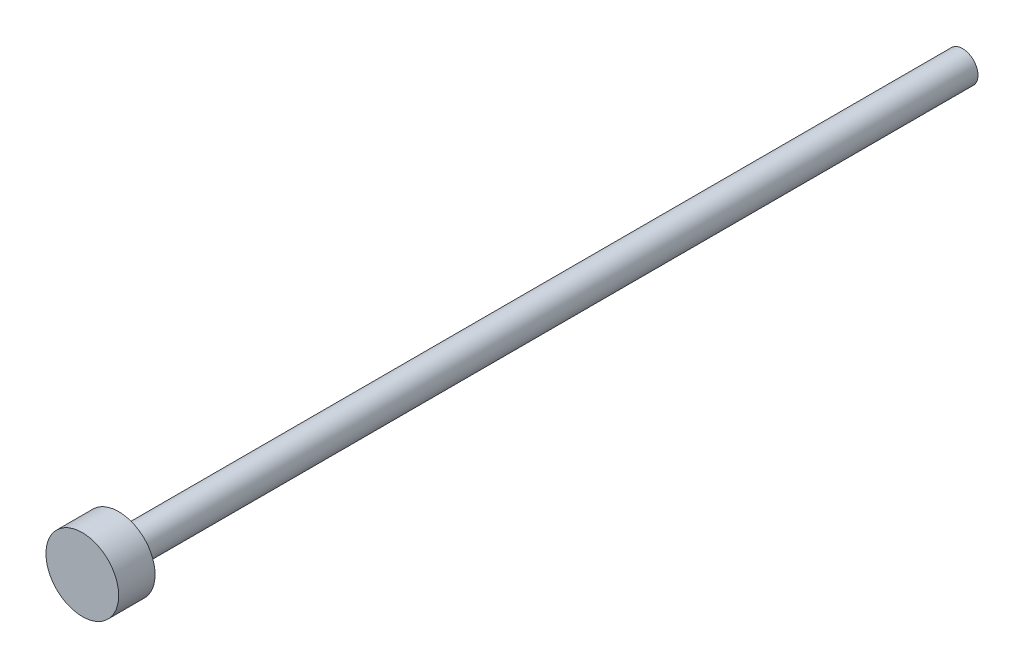
ISO-10303-21;
HEADER;
FILE_DESCRIPTION(('STEP AP214'),'2;1');
FILE_NAME('part.step','',(''),(''),'','','');
FILE_SCHEMA(('AUTOMOTIVE_DESIGN { 1 0 10303 214 1 1 1 1 }'));
ENDSEC;
DATA;
#1=APPLICATION_CONTEXT('core data for automotive mechanical design processes');
#2=APPLICATION_PROTOCOL_DEFINITION('international standard','automotive_design',2000,#1);
#3=PRODUCT_CONTEXT('',#1,'mechanical');
#4=PRODUCT('Part','Part','',(#3));
#5=PRODUCT_RELATED_PRODUCT_CATEGORY('part','',(#4));
#6=PRODUCT_DEFINITION_FORMATION('','',#4);
#7=PRODUCT_DEFINITION_CONTEXT('part definition',#1,'design');
#8=PRODUCT_DEFINITION('design','',#6,#7);
#9=PRODUCT_DEFINITION_SHAPE('','',#8);
#10=(LENGTH_UNIT() NAMED_UNIT(*) SI_UNIT(.MILLI.,.METRE.));
#11=(NAMED_UNIT(*) PLANE_ANGLE_UNIT() SI_UNIT($,.RADIAN.));
#12=(NAMED_UNIT(*) SI_UNIT($,.STERADIAN.) SOLID_ANGLE_UNIT());
#13=UNCERTAINTY_MEASURE_WITH_UNIT(LENGTH_MEASURE(1.E-05),#10,'distance_accuracy_value','');
#14=(GEOMETRIC_REPRESENTATION_CONTEXT(3) GLOBAL_UNCERTAINTY_ASSIGNED_CONTEXT((#13)) GLOBAL_UNIT_ASSIGNED_CONTEXT((#10,
#11,#12)) REPRESENTATION_CONTEXT('',''));
#15=CARTESIAN_POINT('',(0.,0.,0.));
#16=DIRECTION('',(0.,0.,1.));
#17=DIRECTION('',(1.,0.,0.));
#18=AXIS2_PLACEMENT_3D('',#15,#16,#17);
#19=CARTESIAN_POINT('',(3.25,-1.49999999999999,1.));
#20=DIRECTION('',(0.,0.,-1.));
#21=DIRECTION('',(-1.,0.,0.));
#22=AXIS2_PLACEMENT_3D('',#19,#20,#21);
#23=CYLINDRICAL_SURFACE('',#22,0.425);
#24=CARTESIAN_POINT('',(3.25,-1.49999999999999,-23.2));
#25=DIRECTION('',(0.,0.,1.));
#26=DIRECTION('',(1.,0.,0.));
#27=AXIS2_PLACEMENT_3D('',#24,#25,#26);
#28=CIRCLE('',#27,0.425);
#29=CARTESIAN_POINT('',(3.67499999999999,-1.49999999999999,-23.2));
#30=VERTEX_POINT('',#29);
#31=EDGE_CURVE('E55',#30,#30,#28,.T.);
#32=ORIENTED_EDGE('',*,*,#31,.T.);
#33=EDGE_LOOP('',(#32));
#34=FACE_BOUND('',#33,.T.);
#35=CARTESIAN_POINT('',(3.25,-1.49999999999999,0.));
#36=DIRECTION('',(0.,0.,1.));
#37=DIRECTION('',(0.,-1.,0.));
#38=AXIS2_PLACEMENT_3D('',#35,#36,#37);
#39=CIRCLE('',#38,0.425);
#40=CARTESIAN_POINT('',(3.25,-1.92499999999999,0.));
#41=VERTEX_POINT('',#40);
#42=EDGE_CURVE('E11',#41,#41,#39,.T.);
#43=ORIENTED_EDGE('',*,*,#42,.F.);
#44=EDGE_LOOP('',(#43));
#45=FACE_BOUND('',#44,.T.);
#46=ADVANCED_FACE('F49',(#34,#45),#23,.T.);
#47=CARTESIAN_POINT('',(0.,0.,-23.2));
#48=DIRECTION('',(0.,0.,1.));
#49=DIRECTION('',(1.,0.,0.));
#50=AXIS2_PLACEMENT_3D('',#47,#48,#49);
#51=PLANE('',#50);
#52=ORIENTED_EDGE('',*,*,#31,.F.);
#53=EDGE_LOOP('',(#52));
#54=FACE_BOUND('',#53,.T.);
#55=ADVANCED_FACE('F74',(#54),#51,.F.);
#56=CARTESIAN_POINT('',(3.25,-1.49999999999999,-2.82842712474627));
#57=DIRECTION('',(0.,0.,1.));
#58=DIRECTION('',(1.,0.,0.));
#59=AXIS2_PLACEMENT_3D('',#56,#57,#58);
#60=CYLINDRICAL_SURFACE('',#59,1.00000000000003);
#61=CARTESIAN_POINT('',(3.25,-1.49999999999999,0.));
#62=DIRECTION('',(0.,0.,1.));
#63=DIRECTION('',(0.,-1.,0.));
#64=AXIS2_PLACEMENT_3D('',#61,#62,#63);
#65=CIRCLE('',#64,1.00000000000003);
#66=CARTESIAN_POINT('',(3.25,-2.50000000000002,0.));
#67=VERTEX_POINT('',#66);
#68=EDGE_CURVE('E59',#67,#67,#65,.F.);
#69=ORIENTED_EDGE('',*,*,#68,.F.);
#70=EDGE_LOOP('',(#69));
#71=FACE_BOUND('',#70,.T.);
#72=CARTESIAN_POINT('',(3.25,-1.49999999999999,1.));
#73=DIRECTION('',(0.,0.,1.));
#74=DIRECTION('',(1.,0.,0.));
#75=AXIS2_PLACEMENT_3D('',#72,#73,#74);
#76=CIRCLE('',#75,1.00000000000003);
#77=CARTESIAN_POINT('',(4.25000000000002,-1.49999999999999,1.));
#78=VERTEX_POINT('',#77);
#79=EDGE_CURVE('E63',#78,#78,#76,.T.);
#80=ORIENTED_EDGE('',*,*,#79,.F.);
#81=EDGE_LOOP('',(#80));
#82=FACE_BOUND('',#81,.T.);
#83=ADVANCED_FACE('F71',(#71,#82),#60,.T.);
#84=CARTESIAN_POINT('',(0.,0.,0.));
#85=DIRECTION('',(0.,0.,1.));
#86=DIRECTION('',(0.,-1.,0.));
#87=AXIS2_PLACEMENT_3D('',#84,#85,#86);
#88=PLANE('',#87);
#89=ORIENTED_EDGE('',*,*,#42,.T.);
#90=EDGE_LOOP('',(#89));
#91=FACE_BOUND('',#90,.T.);
#92=ORIENTED_EDGE('',*,*,#68,.T.);
#93=EDGE_LOOP('',(#92));
#94=FACE_BOUND('',#93,.T.);
#95=ADVANCED_FACE('F73',(#91,#94),#88,.F.);
#96=CARTESIAN_POINT('',(0.,0.,1.));
#97=DIRECTION('',(0.,0.,1.));
#98=DIRECTION('',(1.,0.,0.));
#99=AXIS2_PLACEMENT_3D('',#96,#97,#98);
#100=PLANE('',#99);
#101=ORIENTED_EDGE('',*,*,#79,.T.);
#102=EDGE_LOOP('',(#101));
#103=FACE_BOUND('',#102,.T.);
#104=ADVANCED_FACE('F69',(#103),#100,.T.);
#105=CLOSED_SHELL('',(#46,#55,#83,#95,#104));
#106=MANIFOLD_SOLID_BREP('B2',#105);
#107=ADVANCED_BREP_SHAPE_REPRESENTATION('',(#18,#106),#14);
#108=SHAPE_DEFINITION_REPRESENTATION(#9,#107);
ENDSEC;
END-ISO-10303-21;
